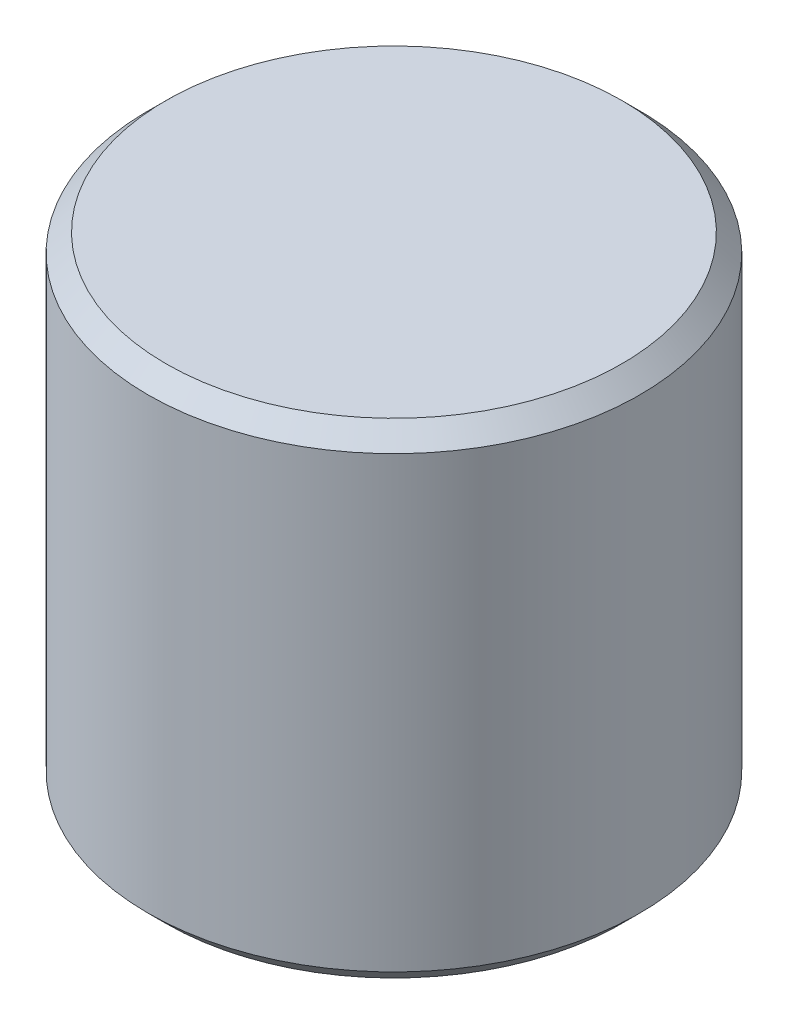
ISO-10303-21;
HEADER;
FILE_DESCRIPTION(('STEP AP214'),'2;1');
FILE_NAME('part.step','',(''),(''),'','','');
FILE_SCHEMA(('AUTOMOTIVE_DESIGN { 1 0 10303 214 1 1 1 1 }'));
ENDSEC;
DATA;
#1=APPLICATION_CONTEXT('core data for automotive mechanical design processes');
#2=APPLICATION_PROTOCOL_DEFINITION('international standard','automotive_design',2000,#1);
#3=PRODUCT_CONTEXT('',#1,'mechanical');
#4=PRODUCT('Part','Part','',(#3));
#5=PRODUCT_RELATED_PRODUCT_CATEGORY('part','',(#4));
#6=PRODUCT_DEFINITION_FORMATION('','',#4);
#7=PRODUCT_DEFINITION_CONTEXT('part definition',#1,'design');
#8=PRODUCT_DEFINITION('design','',#6,#7);
#9=PRODUCT_DEFINITION_SHAPE('','',#8);
#10=(LENGTH_UNIT() NAMED_UNIT(*) SI_UNIT(.MILLI.,.METRE.));
#11=(NAMED_UNIT(*) PLANE_ANGLE_UNIT() SI_UNIT($,.RADIAN.));
#12=(NAMED_UNIT(*) SI_UNIT($,.STERADIAN.) SOLID_ANGLE_UNIT());
#13=UNCERTAINTY_MEASURE_WITH_UNIT(LENGTH_MEASURE(1.E-05),#10,'distance_accuracy_value','');
#14=(GEOMETRIC_REPRESENTATION_CONTEXT(3) GLOBAL_UNCERTAINTY_ASSIGNED_CONTEXT((#13)) GLOBAL_UNIT_ASSIGNED_CONTEXT((#10,
#11,#12)) REPRESENTATION_CONTEXT('',''));
#15=CARTESIAN_POINT('',(0.,0.,0.));
#16=DIRECTION('',(0.,0.,1.));
#17=DIRECTION('',(1.,0.,0.));
#18=AXIS2_PLACEMENT_3D('',#15,#16,#17);
#19=CARTESIAN_POINT('',(0.,13.5,0.));
#20=DIRECTION('',(0.,1.,0.));
#21=DIRECTION('',(0.,0.,1.));
#22=AXIS2_PLACEMENT_3D('',#19,#20,#21);
#23=CYLINDRICAL_SURFACE('',#22,5.5);
#24=CARTESIAN_POINT('',(0.,0.,0.));
#25=DIRECTION('',(0.,1.,0.));
#26=DIRECTION('',(0.,0.,1.));
#27=AXIS2_PLACEMENT_3D('',#24,#25,#26);
#28=CIRCLE('',#27,5.5);
#29=CARTESIAN_POINT('',(0.,0.,5.5));
#30=VERTEX_POINT('',#29);
#31=EDGE_CURVE('E10',#30,#30,#28,.T.);
#32=ORIENTED_EDGE('',*,*,#31,.F.);
#33=EDGE_LOOP('',(#32));
#34=FACE_BOUND('',#33,.T.);
#35=CARTESIAN_POINT('',(0.,2.,0.));
#36=DIRECTION('',(0.,1.,0.));
#37=DIRECTION('',(0.,0.,1.));
#38=AXIS2_PLACEMENT_3D('',#35,#36,#37);
#39=CIRCLE('',#38,5.5);
#40=CARTESIAN_POINT('',(0.,2.,5.5));
#41=VERTEX_POINT('',#40);
#42=EDGE_CURVE('E59',#41,#41,#39,.T.);
#43=ORIENTED_EDGE('',*,*,#42,.T.);
#44=EDGE_LOOP('',(#43));
#45=FACE_BOUND('',#44,.T.);
#46=ADVANCED_FACE('F31',(#34,#45),#23,.F.);
#47=CARTESIAN_POINT('',(5.5,0.,0.));
#48=DIRECTION('',(0.,1.,0.));
#49=DIRECTION('',(0.,0.,1.));
#50=AXIS2_PLACEMENT_3D('',#47,#48,#49);
#51=PLANE('',#50);
#52=CARTESIAN_POINT('',(0.,0.,0.));
#53=DIRECTION('',(0.,1.,0.));
#54=DIRECTION('',(0.,0.,1.));
#55=AXIS2_PLACEMENT_3D('',#52,#53,#54);
#56=CIRCLE('',#55,6.35);
#57=CARTESIAN_POINT('',(0.,0.,6.35));
#58=VERTEX_POINT('',#57);
#59=EDGE_CURVE('E37',#58,#58,#56,.T.);
#60=ORIENTED_EDGE('',*,*,#59,.F.);
#61=EDGE_LOOP('',(#60));
#62=FACE_BOUND('',#61,.T.);
#63=ORIENTED_EDGE('',*,*,#31,.T.);
#64=EDGE_LOOP('',(#63));
#65=FACE_BOUND('',#64,.T.);
#66=ADVANCED_FACE('F87',(#62,#65),#51,.F.);
#67=CARTESIAN_POINT('',(0.,0.,0.));
#68=DIRECTION('',(0.,1.,0.));
#69=DIRECTION('',(0.,0.,1.));
#70=AXIS2_PLACEMENT_3D('',#67,#68,#69);
#71=CONICAL_SURFACE('',#70,6.35,0.785398163397447);
#72=CARTESIAN_POINT('',(0.,0.5,0.));
#73=DIRECTION('',(0.,1.,0.));
#74=DIRECTION('',(0.,0.,1.));
#75=AXIS2_PLACEMENT_3D('',#72,#73,#74);
#76=CIRCLE('',#75,6.85);
#77=CARTESIAN_POINT('',(0.,0.5,6.85));
#78=VERTEX_POINT('',#77);
#79=EDGE_CURVE('E41',#78,#78,#76,.T.);
#80=ORIENTED_EDGE('',*,*,#79,.F.);
#81=EDGE_LOOP('',(#80));
#82=FACE_BOUND('',#81,.T.);
#83=ORIENTED_EDGE('',*,*,#59,.T.);
#84=EDGE_LOOP('',(#83));
#85=FACE_BOUND('',#84,.T.);
#86=ADVANCED_FACE('F92',(#82,#85),#71,.T.);
#87=CARTESIAN_POINT('',(0.,13.5,0.));
#88=DIRECTION('',(0.,1.,0.));
#89=DIRECTION('',(0.,0.,1.));
#90=AXIS2_PLACEMENT_3D('',#87,#88,#89);
#91=CYLINDRICAL_SURFACE('',#90,6.85);
#92=CARTESIAN_POINT('',(0.,13.,0.));
#93=DIRECTION('',(0.,1.,0.));
#94=DIRECTION('',(0.,0.,1.));
#95=AXIS2_PLACEMENT_3D('',#92,#93,#94);
#96=CIRCLE('',#95,6.85);
#97=CARTESIAN_POINT('',(0.,13.,6.85));
#98=VERTEX_POINT('',#97);
#99=EDGE_CURVE('E45',#98,#98,#96,.T.);
#100=ORIENTED_EDGE('',*,*,#99,.F.);
#101=EDGE_LOOP('',(#100));
#102=FACE_BOUND('',#101,.T.);
#103=ORIENTED_EDGE('',*,*,#79,.T.);
#104=EDGE_LOOP('',(#103));
#105=FACE_BOUND('',#104,.T.);
#106=ADVANCED_FACE('F97',(#102,#105),#91,.T.);
#107=CARTESIAN_POINT('',(0.,13.,0.));
#108=DIRECTION('',(0.,-1.,0.));
#109=DIRECTION('',(0.,0.,-1.));
#110=AXIS2_PLACEMENT_3D('',#107,#108,#109);
#111=CONICAL_SURFACE('',#110,6.85,0.785398163397447);
#112=CARTESIAN_POINT('',(0.,13.5,0.));
#113=DIRECTION('',(0.,1.,0.));
#114=DIRECTION('',(0.,0.,1.));
#115=AXIS2_PLACEMENT_3D('',#112,#113,#114);
#116=CIRCLE('',#115,6.35);
#117=CARTESIAN_POINT('',(0.,13.5,6.35));
#118=VERTEX_POINT('',#117);
#119=EDGE_CURVE('E50',#118,#118,#116,.T.);
#120=ORIENTED_EDGE('',*,*,#119,.F.);
#121=EDGE_LOOP('',(#120));
#122=FACE_BOUND('',#121,.T.);
#123=ORIENTED_EDGE('',*,*,#99,.T.);
#124=EDGE_LOOP('',(#123));
#125=FACE_BOUND('',#124,.T.);
#126=ADVANCED_FACE('F83',(#122,#125),#111,.T.);
#127=CARTESIAN_POINT('',(6.35,13.5,0.));
#128=DIRECTION('',(0.,-1.,0.));
#129=DIRECTION('',(0.,0.,-1.));
#130=AXIS2_PLACEMENT_3D('',#127,#128,#129);
#131=PLANE('',#130);
#132=ORIENTED_EDGE('',*,*,#119,.T.);
#133=EDGE_LOOP('',(#132));
#134=FACE_BOUND('',#133,.T.);
#135=ADVANCED_FACE('F78',(#134),#131,.F.);
#136=CARTESIAN_POINT('',(3.05,11.6,0.));
#137=DIRECTION('',(0.,1.,0.));
#138=DIRECTION('',(0.,0.,1.));
#139=AXIS2_PLACEMENT_3D('',#136,#137,#138);
#140=PLANE('',#139);
#141=CARTESIAN_POINT('',(0.,11.6,0.));
#142=DIRECTION('',(0.,1.,0.));
#143=DIRECTION('',(0.,0.,1.));
#144=AXIS2_PLACEMENT_3D('',#141,#142,#143);
#145=CIRCLE('',#144,3.05);
#146=CARTESIAN_POINT('',(0.,11.6,3.05));
#147=VERTEX_POINT('',#146);
#148=EDGE_CURVE('E53',#147,#147,#145,.T.);
#149=ORIENTED_EDGE('',*,*,#148,.F.);
#150=EDGE_LOOP('',(#149));
#151=FACE_BOUND('',#150,.T.);
#152=ADVANCED_FACE('F73',(#151),#140,.F.);
#153=CARTESIAN_POINT('',(0.,13.5,0.));
#154=DIRECTION('',(0.,1.,0.));
#155=DIRECTION('',(0.,0.,1.));
#156=AXIS2_PLACEMENT_3D('',#153,#154,#155);
#157=CYLINDRICAL_SURFACE('',#156,3.05);
#158=CARTESIAN_POINT('',(0.,2.,0.));
#159=DIRECTION('',(0.,1.,0.));
#160=DIRECTION('',(0.,0.,1.));
#161=AXIS2_PLACEMENT_3D('',#158,#159,#160);
#162=CIRCLE('',#161,3.05);
#163=CARTESIAN_POINT('',(0.,2.,3.05));
#164=VERTEX_POINT('',#163);
#165=EDGE_CURVE('E56',#164,#164,#162,.T.);
#166=ORIENTED_EDGE('',*,*,#165,.F.);
#167=EDGE_LOOP('',(#166));
#168=FACE_BOUND('',#167,.T.);
#169=ORIENTED_EDGE('',*,*,#148,.T.);
#170=EDGE_LOOP('',(#169));
#171=FACE_BOUND('',#170,.T.);
#172=ADVANCED_FACE('F67',(#168,#171),#157,.F.);
#173=CARTESIAN_POINT('',(5.5,2.,0.));
#174=DIRECTION('',(0.,1.,0.));
#175=DIRECTION('',(0.,0.,1.));
#176=AXIS2_PLACEMENT_3D('',#173,#174,#175);
#177=PLANE('',#176);
#178=ORIENTED_EDGE('',*,*,#42,.F.);
#179=EDGE_LOOP('',(#178));
#180=FACE_BOUND('',#179,.T.);
#181=ORIENTED_EDGE('',*,*,#165,.T.);
#182=EDGE_LOOP('',(#181));
#183=FACE_BOUND('',#182,.T.);
#184=ADVANCED_FACE('F64',(#180,#183),#177,.F.);
#185=CLOSED_SHELL('',(#46,#66,#86,#106,#126,#135,#152,#172,#184));
#186=MANIFOLD_SOLID_BREP('B2',#185);
#187=ADVANCED_BREP_SHAPE_REPRESENTATION('',(#18,#186),#14);
#188=SHAPE_DEFINITION_REPRESENTATION(#9,#187);
ENDSEC;
END-ISO-10303-21;
